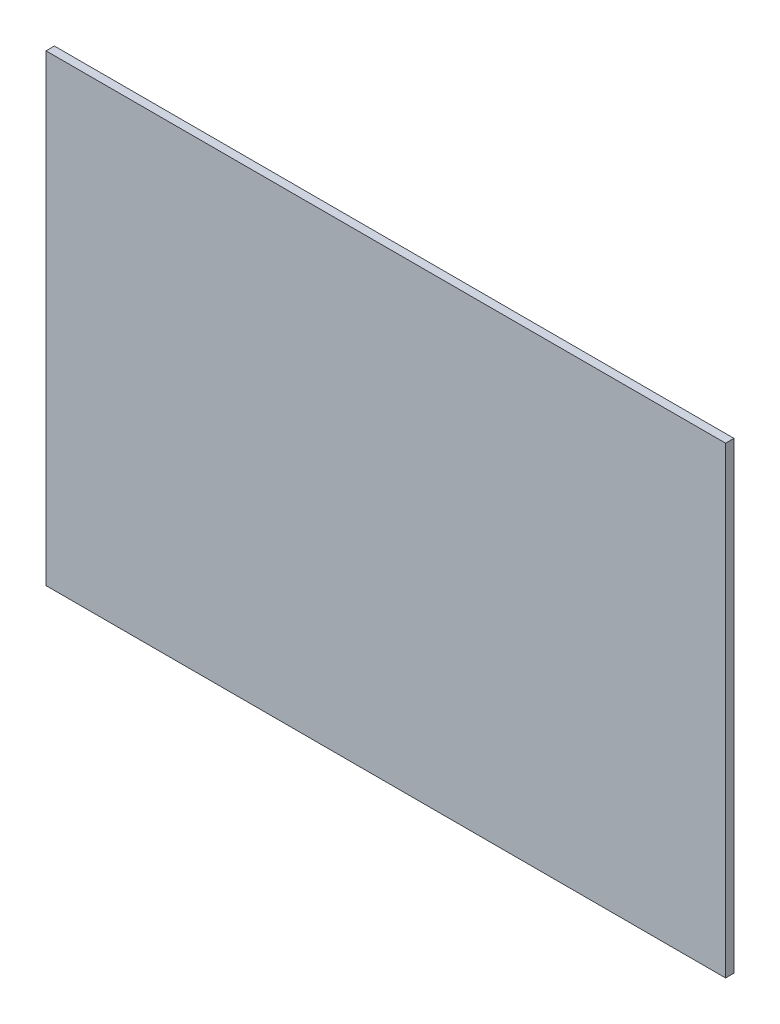
ISO-10303-21;
HEADER;
FILE_DESCRIPTION(('STEP AP214'),'2;1');
FILE_NAME('part.step','',(''),(''),'','','');
FILE_SCHEMA(('AUTOMOTIVE_DESIGN { 1 0 10303 214 1 1 1 1 }'));
ENDSEC;
DATA;
#1=APPLICATION_CONTEXT('core data for automotive mechanical design processes');
#2=APPLICATION_PROTOCOL_DEFINITION('international standard','automotive_design',2000,#1);
#3=PRODUCT_CONTEXT('',#1,'mechanical');
#4=PRODUCT('Part','Part','',(#3));
#5=PRODUCT_RELATED_PRODUCT_CATEGORY('part','',(#4));
#6=PRODUCT_DEFINITION_FORMATION('','',#4);
#7=PRODUCT_DEFINITION_CONTEXT('part definition',#1,'design');
#8=PRODUCT_DEFINITION('design','',#6,#7);
#9=PRODUCT_DEFINITION_SHAPE('','',#8);
#10=(LENGTH_UNIT() NAMED_UNIT(*) SI_UNIT(.MILLI.,.METRE.));
#11=(NAMED_UNIT(*) PLANE_ANGLE_UNIT() SI_UNIT($,.RADIAN.));
#12=(NAMED_UNIT(*) SI_UNIT($,.STERADIAN.) SOLID_ANGLE_UNIT());
#13=UNCERTAINTY_MEASURE_WITH_UNIT(LENGTH_MEASURE(1.E-05),#10,'distance_accuracy_value','');
#14=(GEOMETRIC_REPRESENTATION_CONTEXT(3) GLOBAL_UNCERTAINTY_ASSIGNED_CONTEXT((#13)) GLOBAL_UNIT_ASSIGNED_CONTEXT((#10,
#11,#12)) REPRESENTATION_CONTEXT('',''));
#15=CARTESIAN_POINT('',(0.,0.,0.));
#16=DIRECTION('',(0.,0.,1.));
#17=DIRECTION('',(1.,0.,0.));
#18=AXIS2_PLACEMENT_3D('',#15,#16,#17);
#19=CARTESIAN_POINT('',(25.038151502088,8.00075560650967,0.8));
#20=DIRECTION('',(-1.,0.,0.));
#21=DIRECTION('',(0.,-1.,0.));
#22=AXIS2_PLACEMENT_3D('',#19,#20,#21);
#23=PLANE('',#22);
#24=DIRECTION('',(0.,1.,0.));
#25=VECTOR('',#24,1.);
#26=CARTESIAN_POINT('',(25.038151502088,8.00075560650967,0.));
#27=LINE('',#26,#25);
#28=CARTESIAN_POINT('',(25.038151502088,-36.2996425495368,0.));
#29=VERTEX_POINT('',#28);
#30=CARTESIAN_POINT('',(25.038151502088,8.00075560650967,0.));
#31=VERTEX_POINT('',#30);
#32=EDGE_CURVE('E96',#29,#31,#27,.T.);
#33=ORIENTED_EDGE('',*,*,#32,.T.);
#34=DIRECTION('',(0.,0.,-1.));
#35=VECTOR('',#34,1.);
#36=CARTESIAN_POINT('',(25.038151502088,8.00075560650967,0.8));
#37=LINE('',#36,#35);
#38=CARTESIAN_POINT('',(25.038151502088,8.00075560650967,0.8));
#39=VERTEX_POINT('',#38);
#40=EDGE_CURVE('E11',#39,#31,#37,.T.);
#41=ORIENTED_EDGE('',*,*,#40,.F.);
#42=DIRECTION('',(0.,1.,0.));
#43=VECTOR('',#42,1.);
#44=CARTESIAN_POINT('',(25.038151502088,8.00075560650967,0.8));
#45=LINE('',#44,#43);
#46=CARTESIAN_POINT('',(25.038151502088,-36.2996425495368,0.8));
#47=VERTEX_POINT('',#46);
#48=EDGE_CURVE('E84',#47,#39,#45,.T.);
#49=ORIENTED_EDGE('',*,*,#48,.F.);
#50=DIRECTION('',(0.,0.,-1.));
#51=VECTOR('',#50,1.);
#52=CARTESIAN_POINT('',(25.038151502088,-36.2996425495368,0.8));
#53=LINE('',#52,#51);
#54=EDGE_CURVE('E92',#47,#29,#53,.T.);
#55=ORIENTED_EDGE('',*,*,#54,.T.);
#56=EDGE_LOOP('',(#33,#41,#49,#55));
#57=FACE_BOUND('',#56,.T.);
#58=ADVANCED_FACE('F33',(#57),#23,.F.);
#59=CARTESIAN_POINT('',(25.038151502088,8.00075560650967,0.8));
#60=DIRECTION('',(0.,-1.,0.));
#61=DIRECTION('',(0.,0.,-1.));
#62=AXIS2_PLACEMENT_3D('',#59,#60,#61);
#63=PLANE('',#62);
#64=DIRECTION('',(-1.,0.,0.));
#65=VECTOR('',#64,1.);
#66=CARTESIAN_POINT('',(25.038151502088,8.00075560650967,0.));
#67=LINE('',#66,#65);
#68=CARTESIAN_POINT('',(-39.961848497912,8.00075560650967,0.));
#69=VERTEX_POINT('',#68);
#70=EDGE_CURVE('E88',#31,#69,#67,.T.);
#71=ORIENTED_EDGE('',*,*,#70,.T.);
#72=DIRECTION('',(0.,0.,-1.));
#73=VECTOR('',#72,1.);
#74=CARTESIAN_POINT('',(-39.961848497912,8.00075560650967,0.8));
#75=LINE('',#74,#73);
#76=CARTESIAN_POINT('',(-39.961848497912,8.00075560650967,0.8));
#77=VERTEX_POINT('',#76);
#78=EDGE_CURVE('E41',#77,#69,#75,.T.);
#79=ORIENTED_EDGE('',*,*,#78,.F.);
#80=DIRECTION('',(-1.,0.,0.));
#81=VECTOR('',#80,1.);
#82=CARTESIAN_POINT('',(25.038151502088,8.00075560650967,0.8));
#83=LINE('',#82,#81);
#84=EDGE_CURVE('E79',#39,#77,#83,.T.);
#85=ORIENTED_EDGE('',*,*,#84,.F.);
#86=ORIENTED_EDGE('',*,*,#40,.T.);
#87=EDGE_LOOP('',(#71,#79,#85,#86));
#88=FACE_BOUND('',#87,.T.);
#89=ADVANCED_FACE('F87',(#88),#63,.F.);
#90=CARTESIAN_POINT('',(-39.961848497912,8.00075560650967,0.8));
#91=DIRECTION('',(1.,0.,0.));
#92=DIRECTION('',(0.,0.,-1.));
#93=AXIS2_PLACEMENT_3D('',#90,#91,#92);
#94=PLANE('',#93);
#95=DIRECTION('',(0.,-1.,0.));
#96=VECTOR('',#95,1.);
#97=CARTESIAN_POINT('',(-39.961848497912,8.00075560650967,0.));
#98=LINE('',#97,#96);
#99=CARTESIAN_POINT('',(-39.961848497912,-36.2996425495368,0.));
#100=VERTEX_POINT('',#99);
#101=EDGE_CURVE('E66',#69,#100,#98,.T.);
#102=ORIENTED_EDGE('',*,*,#101,.T.);
#103=DIRECTION('',(0.,0.,-1.));
#104=VECTOR('',#103,1.);
#105=CARTESIAN_POINT('',(-39.961848497912,-36.2996425495368,0.8));
#106=LINE('',#105,#104);
#107=CARTESIAN_POINT('',(-39.961848497912,-36.2996425495368,0.8));
#108=VERTEX_POINT('',#107);
#109=EDGE_CURVE('E89',#108,#100,#106,.T.);
#110=ORIENTED_EDGE('',*,*,#109,.F.);
#111=DIRECTION('',(0.,-1.,0.));
#112=VECTOR('',#111,1.);
#113=CARTESIAN_POINT('',(-39.961848497912,8.00075560650967,0.8));
#114=LINE('',#113,#112);
#115=EDGE_CURVE('E82',#77,#108,#114,.T.);
#116=ORIENTED_EDGE('',*,*,#115,.F.);
#117=ORIENTED_EDGE('',*,*,#78,.T.);
#118=EDGE_LOOP('',(#102,#110,#116,#117));
#119=FACE_BOUND('',#118,.T.);
#120=ADVANCED_FACE('F90',(#119),#94,.F.);
#121=CARTESIAN_POINT('',(-39.961848497912,-36.2996425495368,0.8));
#122=DIRECTION('',(0.,1.,0.));
#123=DIRECTION('',(0.,0.,1.));
#124=AXIS2_PLACEMENT_3D('',#121,#122,#123);
#125=PLANE('',#124);
#126=DIRECTION('',(1.,0.,0.));
#127=VECTOR('',#126,1.);
#128=CARTESIAN_POINT('',(-39.961848497912,-36.2996425495368,0.));
#129=LINE('',#128,#127);
#130=EDGE_CURVE('E72',#100,#29,#129,.T.);
#131=ORIENTED_EDGE('',*,*,#130,.T.);
#132=ORIENTED_EDGE('',*,*,#54,.F.);
#133=DIRECTION('',(1.,0.,0.));
#134=VECTOR('',#133,1.);
#135=CARTESIAN_POINT('',(-39.961848497912,-36.2996425495368,0.8));
#136=LINE('',#135,#134);
#137=EDGE_CURVE('E49',#108,#47,#136,.T.);
#138=ORIENTED_EDGE('',*,*,#137,.F.);
#139=ORIENTED_EDGE('',*,*,#109,.T.);
#140=EDGE_LOOP('',(#131,#132,#138,#139));
#141=FACE_BOUND('',#140,.T.);
#142=ADVANCED_FACE('F103',(#141),#125,.F.);
#143=CARTESIAN_POINT('',(0.,0.,0.8));
#144=DIRECTION('',(0.,0.,1.));
#145=DIRECTION('',(1.,0.,0.));
#146=AXIS2_PLACEMENT_3D('',#143,#144,#145);
#147=PLANE('',#146);
#148=ORIENTED_EDGE('',*,*,#48,.T.);
#149=ORIENTED_EDGE('',*,*,#84,.T.);
#150=ORIENTED_EDGE('',*,*,#115,.T.);
#151=ORIENTED_EDGE('',*,*,#137,.T.);
#152=EDGE_LOOP('',(#148,#149,#150,#151));
#153=FACE_BOUND('',#152,.T.);
#154=ADVANCED_FACE('F80',(#153),#147,.T.);
#155=CARTESIAN_POINT('',(0.,0.,0.));
#156=DIRECTION('',(0.,0.,1.));
#157=DIRECTION('',(1.,0.,0.));
#158=AXIS2_PLACEMENT_3D('',#155,#156,#157);
#159=PLANE('',#158);
#160=ORIENTED_EDGE('',*,*,#32,.F.);
#161=ORIENTED_EDGE('',*,*,#130,.F.);
#162=ORIENTED_EDGE('',*,*,#101,.F.);
#163=ORIENTED_EDGE('',*,*,#70,.F.);
#164=EDGE_LOOP('',(#160,#161,#162,#163));
#165=FACE_BOUND('',#164,.T.);
#166=ADVANCED_FACE('F106',(#165),#159,.F.);
#167=CLOSED_SHELL('',(#58,#89,#120,#142,#154,#166));
#168=MANIFOLD_SOLID_BREP('B2',#167);
#169=ADVANCED_BREP_SHAPE_REPRESENTATION('',(#18,#168),#14);
#170=SHAPE_DEFINITION_REPRESENTATION(#9,#169);
ENDSEC;
END-ISO-10303-21;
